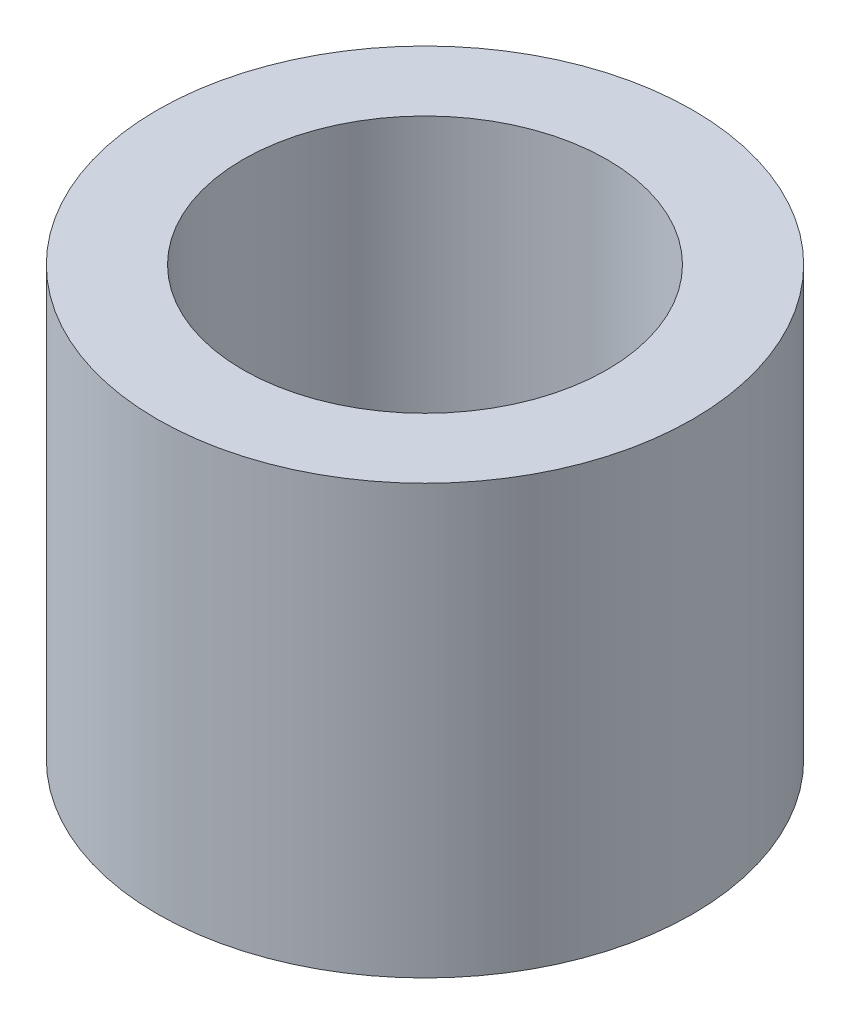
ISO-10303-21;
HEADER;
FILE_DESCRIPTION(('STEP AP214'),'2;1');
FILE_NAME('part.step','',(''),(''),'','','');
FILE_SCHEMA(('AUTOMOTIVE_DESIGN { 1 0 10303 214 1 1 1 1 }'));
ENDSEC;
DATA;
#1=APPLICATION_CONTEXT('core data for automotive mechanical design processes');
#2=APPLICATION_PROTOCOL_DEFINITION('international standard','automotive_design',2000,#1);
#3=PRODUCT_CONTEXT('',#1,'mechanical');
#4=PRODUCT('Part','Part','',(#3));
#5=PRODUCT_RELATED_PRODUCT_CATEGORY('part','',(#4));
#6=PRODUCT_DEFINITION_FORMATION('','',#4);
#7=PRODUCT_DEFINITION_CONTEXT('part definition',#1,'design');
#8=PRODUCT_DEFINITION('design','',#6,#7);
#9=PRODUCT_DEFINITION_SHAPE('','',#8);
#10=(LENGTH_UNIT() NAMED_UNIT(*) SI_UNIT(.MILLI.,.METRE.));
#11=(NAMED_UNIT(*) PLANE_ANGLE_UNIT() SI_UNIT($,.RADIAN.));
#12=(NAMED_UNIT(*) SI_UNIT($,.STERADIAN.) SOLID_ANGLE_UNIT());
#13=UNCERTAINTY_MEASURE_WITH_UNIT(LENGTH_MEASURE(1.E-05),#10,'distance_accuracy_value','');
#14=(GEOMETRIC_REPRESENTATION_CONTEXT(3) GLOBAL_UNCERTAINTY_ASSIGNED_CONTEXT((#13)) GLOBAL_UNIT_ASSIGNED_CONTEXT((#10,
#11,#12)) REPRESENTATION_CONTEXT('',''));
#15=CARTESIAN_POINT('',(0.,0.,0.));
#16=DIRECTION('',(0.,0.,1.));
#17=DIRECTION('',(1.,0.,0.));
#18=AXIS2_PLACEMENT_3D('',#15,#16,#17);
#19=CARTESIAN_POINT('',(0.,4.,0.));
#20=DIRECTION('',(0.,1.,0.));
#21=DIRECTION('',(0.,0.,1.));
#22=AXIS2_PLACEMENT_3D('',#19,#20,#21);
#23=PLANE('',#22);
#24=CARTESIAN_POINT('',(0.,4.,0.));
#25=DIRECTION('',(0.,1.,0.));
#26=DIRECTION('',(0.,0.,1.));
#27=AXIS2_PLACEMENT_3D('',#24,#25,#26);
#28=CIRCLE('',#27,2.5);
#29=CARTESIAN_POINT('',(0.,4.,2.5));
#30=VERTEX_POINT('',#29);
#31=EDGE_CURVE('E10',#30,#30,#28,.T.);
#32=ORIENTED_EDGE('',*,*,#31,.T.);
#33=EDGE_LOOP('',(#32));
#34=FACE_BOUND('',#33,.T.);
#35=CARTESIAN_POINT('',(0.,4.,0.));
#36=DIRECTION('',(0.,1.,0.));
#37=DIRECTION('',(0.,0.,1.));
#38=AXIS2_PLACEMENT_3D('',#35,#36,#37);
#39=CIRCLE('',#38,1.7);
#40=CARTESIAN_POINT('',(0.,4.,1.7));
#41=VERTEX_POINT('',#40);
#42=EDGE_CURVE('E45',#41,#41,#39,.T.);
#43=ORIENTED_EDGE('',*,*,#42,.F.);
#44=EDGE_LOOP('',(#43));
#45=FACE_BOUND('',#44,.T.);
#46=ADVANCED_FACE('F34',(#34,#45),#23,.T.);
#47=CARTESIAN_POINT('',(0.,0.,0.));
#48=DIRECTION('',(0.,1.,0.));
#49=DIRECTION('',(0.,0.,1.));
#50=AXIS2_PLACEMENT_3D('',#47,#48,#49);
#51=PLANE('',#50);
#52=CARTESIAN_POINT('',(0.,0.,0.));
#53=DIRECTION('',(0.,1.,0.));
#54=DIRECTION('',(0.,0.,1.));
#55=AXIS2_PLACEMENT_3D('',#52,#53,#54);
#56=CIRCLE('',#55,2.5);
#57=CARTESIAN_POINT('',(0.,0.,2.5));
#58=VERTEX_POINT('',#57);
#59=EDGE_CURVE('E38',#58,#58,#56,.T.);
#60=ORIENTED_EDGE('',*,*,#59,.F.);
#61=EDGE_LOOP('',(#60));
#62=FACE_BOUND('',#61,.T.);
#63=CARTESIAN_POINT('',(0.,0.,0.));
#64=DIRECTION('',(0.,1.,0.));
#65=DIRECTION('',(0.,0.,1.));
#66=AXIS2_PLACEMENT_3D('',#63,#64,#65);
#67=CIRCLE('',#66,1.7);
#68=CARTESIAN_POINT('',(0.,0.,1.7));
#69=VERTEX_POINT('',#68);
#70=EDGE_CURVE('E47',#69,#69,#67,.T.);
#71=ORIENTED_EDGE('',*,*,#70,.T.);
#72=EDGE_LOOP('',(#71));
#73=FACE_BOUND('',#72,.T.);
#74=ADVANCED_FACE('F57',(#62,#73),#51,.F.);
#75=CARTESIAN_POINT('',(0.,4.,0.));
#76=DIRECTION('',(0.,-1.,0.));
#77=DIRECTION('',(0.,0.,-1.));
#78=AXIS2_PLACEMENT_3D('',#75,#76,#77);
#79=CYLINDRICAL_SURFACE('',#78,2.5);
#80=ORIENTED_EDGE('',*,*,#31,.F.);
#81=EDGE_LOOP('',(#80));
#82=FACE_BOUND('',#81,.T.);
#83=ORIENTED_EDGE('',*,*,#59,.T.);
#84=EDGE_LOOP('',(#83));
#85=FACE_BOUND('',#84,.T.);
#86=ADVANCED_FACE('F36',(#82,#85),#79,.T.);
#87=CARTESIAN_POINT('',(0.,4.,0.));
#88=DIRECTION('',(0.,-1.,0.));
#89=DIRECTION('',(0.,0.,-1.));
#90=AXIS2_PLACEMENT_3D('',#87,#88,#89);
#91=CYLINDRICAL_SURFACE('',#90,1.7);
#92=ORIENTED_EDGE('',*,*,#42,.T.);
#93=EDGE_LOOP('',(#92));
#94=FACE_BOUND('',#93,.T.);
#95=ORIENTED_EDGE('',*,*,#70,.F.);
#96=EDGE_LOOP('',(#95));
#97=FACE_BOUND('',#96,.T.);
#98=ADVANCED_FACE('F53',(#94,#97),#91,.F.);
#99=CLOSED_SHELL('',(#46,#74,#86,#98));
#100=MANIFOLD_SOLID_BREP('B2',#99);
#101=ADVANCED_BREP_SHAPE_REPRESENTATION('',(#18,#100),#14);
#102=SHAPE_DEFINITION_REPRESENTATION(#9,#101);
ENDSEC;
END-ISO-10303-21;
